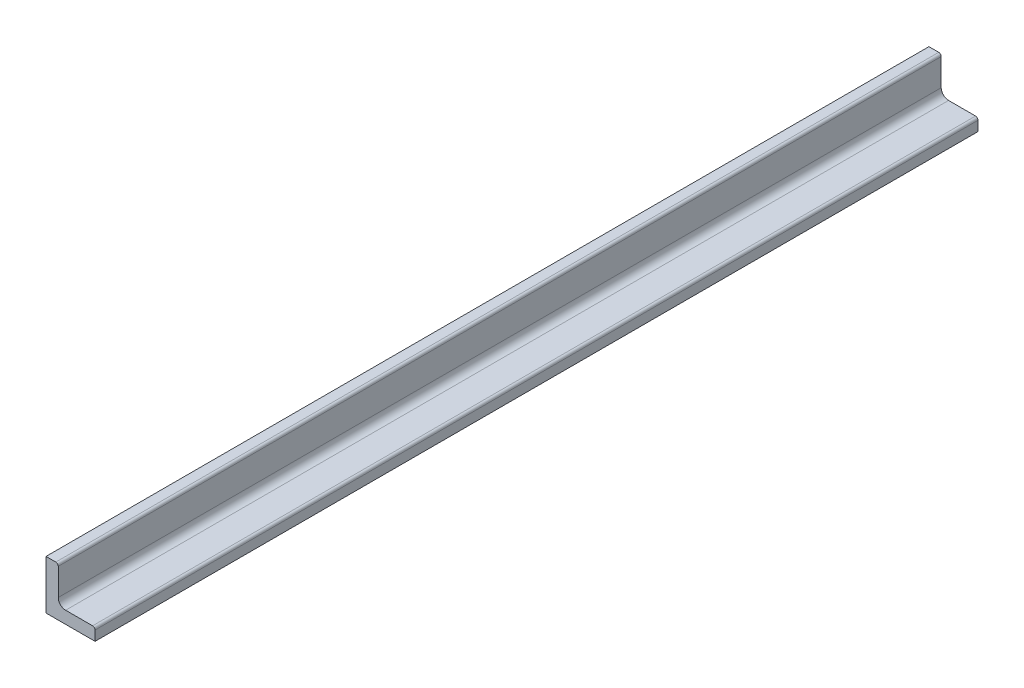
ISO-10303-21;
HEADER;
FILE_DESCRIPTION(('STEP AP214'),'2;1');
FILE_NAME('part.step','',(''),(''),'','','');
FILE_SCHEMA(('AUTOMOTIVE_DESIGN { 1 0 10303 214 1 1 1 1 }'));
ENDSEC;
DATA;
#1=APPLICATION_CONTEXT('core data for automotive mechanical design processes');
#2=APPLICATION_PROTOCOL_DEFINITION('international standard','automotive_design',2000,#1);
#3=PRODUCT_CONTEXT('',#1,'mechanical');
#4=PRODUCT('Part','Part','',(#3));
#5=PRODUCT_RELATED_PRODUCT_CATEGORY('part','',(#4));
#6=PRODUCT_DEFINITION_FORMATION('','',#4);
#7=PRODUCT_DEFINITION_CONTEXT('part definition',#1,'design');
#8=PRODUCT_DEFINITION('design','',#6,#7);
#9=PRODUCT_DEFINITION_SHAPE('','',#8);
#10=(LENGTH_UNIT() NAMED_UNIT(*) SI_UNIT(.MILLI.,.METRE.));
#11=(NAMED_UNIT(*) PLANE_ANGLE_UNIT() SI_UNIT($,.RADIAN.));
#12=(NAMED_UNIT(*) SI_UNIT($,.STERADIAN.) SOLID_ANGLE_UNIT());
#13=UNCERTAINTY_MEASURE_WITH_UNIT(LENGTH_MEASURE(1.E-05),#10,'distance_accuracy_value','');
#14=(GEOMETRIC_REPRESENTATION_CONTEXT(3) GLOBAL_UNCERTAINTY_ASSIGNED_CONTEXT((#13)) GLOBAL_UNIT_ASSIGNED_CONTEXT((#10,
#11,#12)) REPRESENTATION_CONTEXT('',''));
#15=CARTESIAN_POINT('',(0.,0.,0.));
#16=DIRECTION('',(0.,0.,1.));
#17=DIRECTION('',(1.,0.,0.));
#18=AXIS2_PLACEMENT_3D('',#15,#16,#17);
#19=CARTESIAN_POINT('',(1.905,1.905,228.6));
#20=DIRECTION('',(0.,0.,-1.));
#21=DIRECTION('',(-1.,0.,0.));
#22=AXIS2_PLACEMENT_3D('',#19,#20,#21);
#23=CYLINDRICAL_SURFACE('',#22,1.905);
#24=CARTESIAN_POINT('',(1.905,1.905,0.));
#25=DIRECTION('',(0.,0.,-1.));
#26=DIRECTION('',(1.,0.,0.));
#27=AXIS2_PLACEMENT_3D('',#24,#25,#26);
#28=CIRCLE('',#27,1.905);
#29=CARTESIAN_POINT('',(1.905,0.,0.));
#30=VERTEX_POINT('',#29);
#31=CARTESIAN_POINT('',(0.,1.905,0.));
#32=VERTEX_POINT('',#31);
#33=EDGE_CURVE('E143',#30,#32,#28,.T.);
#34=ORIENTED_EDGE('',*,*,#33,.T.);
#35=DIRECTION('',(0.,0.,-1.));
#36=VECTOR('',#35,1.);
#37=CARTESIAN_POINT('',(0.,1.905,228.6));
#38=LINE('',#37,#36);
#39=CARTESIAN_POINT('',(0.,1.905,228.6));
#40=VERTEX_POINT('',#39);
#41=EDGE_CURVE('E11',#40,#32,#38,.T.);
#42=ORIENTED_EDGE('',*,*,#41,.F.);
#43=CARTESIAN_POINT('',(1.905,1.905,228.6));
#44=DIRECTION('',(0.,0.,-1.));
#45=DIRECTION('',(1.,0.,0.));
#46=AXIS2_PLACEMENT_3D('',#43,#44,#45);
#47=CIRCLE('',#46,1.905);
#48=CARTESIAN_POINT('',(1.905,0.,228.6));
#49=VERTEX_POINT('',#48);
#50=EDGE_CURVE('E161',#49,#40,#47,.T.);
#51=ORIENTED_EDGE('',*,*,#50,.F.);
#52=DIRECTION('',(0.,0.,-1.));
#53=VECTOR('',#52,1.);
#54=CARTESIAN_POINT('',(1.905,0.,228.6));
#55=LINE('',#54,#53);
#56=EDGE_CURVE('E139',#49,#30,#55,.T.);
#57=ORIENTED_EDGE('',*,*,#56,.T.);
#58=EDGE_LOOP('',(#34,#42,#51,#57));
#59=FACE_BOUND('',#58,.T.);
#60=ADVANCED_FACE('F35',(#59),#23,.F.);
#61=CARTESIAN_POINT('',(0.,1.905,228.6));
#62=DIRECTION('',(-1.,0.,0.));
#63=DIRECTION('',(0.,-1.,0.));
#64=AXIS2_PLACEMENT_3D('',#61,#62,#63);
#65=PLANE('',#64);
#66=DIRECTION('',(0.,1.,0.));
#67=VECTOR('',#66,1.);
#68=CARTESIAN_POINT('',(0.,1.905,0.));
#69=LINE('',#68,#67);
#70=CARTESIAN_POINT('',(0.,8.89000000000002,0.));
#71=VERTEX_POINT('',#70);
#72=EDGE_CURVE('E146',#32,#71,#69,.T.);
#73=ORIENTED_EDGE('',*,*,#72,.T.);
#74=DIRECTION('',(0.,0.,-1.));
#75=VECTOR('',#74,1.);
#76=CARTESIAN_POINT('',(0.,8.89000000000002,228.6));
#77=LINE('',#76,#75);
#78=CARTESIAN_POINT('',(0.,8.89000000000002,228.6));
#79=VERTEX_POINT('',#78);
#80=EDGE_CURVE('E43',#79,#71,#77,.T.);
#81=ORIENTED_EDGE('',*,*,#80,.F.);
#82=DIRECTION('',(0.,1.,0.));
#83=VECTOR('',#82,1.);
#84=CARTESIAN_POINT('',(0.,1.905,228.6));
#85=LINE('',#84,#83);
#86=EDGE_CURVE('E100',#40,#79,#85,.T.);
#87=ORIENTED_EDGE('',*,*,#86,.F.);
#88=ORIENTED_EDGE('',*,*,#41,.T.);
#89=EDGE_LOOP('',(#73,#81,#87,#88));
#90=FACE_BOUND('',#89,.T.);
#91=ADVANCED_FACE('F210',(#90),#65,.F.);
#92=CARTESIAN_POINT('',(-0.635,8.89000000000002,228.6));
#93=DIRECTION('',(0.,0.,-1.));
#94=DIRECTION('',(-1.,0.,0.));
#95=AXIS2_PLACEMENT_3D('',#92,#93,#94);
#96=CYLINDRICAL_SURFACE('',#95,0.634999999999998);
#97=CARTESIAN_POINT('',(-0.635,8.89000000000002,0.));
#98=DIRECTION('',(0.,0.,1.));
#99=DIRECTION('',(1.,0.,0.));
#100=AXIS2_PLACEMENT_3D('',#97,#98,#99);
#101=CIRCLE('',#100,0.634999999999998);
#102=CARTESIAN_POINT('',(-0.635,9.52500000000002,0.));
#103=VERTEX_POINT('',#102);
#104=EDGE_CURVE('E148',#71,#103,#101,.T.);
#105=ORIENTED_EDGE('',*,*,#104,.T.);
#106=DIRECTION('',(0.,0.,-1.));
#107=VECTOR('',#106,1.);
#108=CARTESIAN_POINT('',(-0.635,9.52500000000002,228.6));
#109=LINE('',#108,#107);
#110=CARTESIAN_POINT('',(-0.635,9.52500000000002,228.6));
#111=VERTEX_POINT('',#110);
#112=EDGE_CURVE('E174',#111,#103,#109,.T.);
#113=ORIENTED_EDGE('',*,*,#112,.F.);
#114=CARTESIAN_POINT('',(-0.635,8.89000000000002,228.6));
#115=DIRECTION('',(0.,0.,1.));
#116=DIRECTION('',(1.,0.,0.));
#117=AXIS2_PLACEMENT_3D('',#114,#115,#116);
#118=CIRCLE('',#117,0.634999999999998);
#119=EDGE_CURVE('E182',#79,#111,#118,.T.);
#120=ORIENTED_EDGE('',*,*,#119,.F.);
#121=ORIENTED_EDGE('',*,*,#80,.T.);
#122=EDGE_LOOP('',(#105,#113,#120,#121));
#123=FACE_BOUND('',#122,.T.);
#124=ADVANCED_FACE('F180',(#123),#96,.T.);
#125=CARTESIAN_POINT('',(-0.635,9.52500000000002,228.6));
#126=DIRECTION('',(0.,-1.,0.));
#127=DIRECTION('',(0.,0.,-1.));
#128=AXIS2_PLACEMENT_3D('',#125,#126,#127);
#129=PLANE('',#128);
#130=DIRECTION('',(-1.,0.,0.));
#131=VECTOR('',#130,1.);
#132=CARTESIAN_POINT('',(-0.635,9.52500000000002,0.));
#133=LINE('',#132,#131);
#134=CARTESIAN_POINT('',(-3.17499999999999,9.52500000000002,0.));
#135=VERTEX_POINT('',#134);
#136=EDGE_CURVE('E150',#103,#135,#133,.T.);
#137=ORIENTED_EDGE('',*,*,#136,.T.);
#138=DIRECTION('',(0.,0.,-1.));
#139=VECTOR('',#138,1.);
#140=CARTESIAN_POINT('',(-3.17499999999999,9.52500000000002,228.6));
#141=LINE('',#140,#139);
#142=CARTESIAN_POINT('',(-3.17499999999999,9.52500000000002,228.6));
#143=VERTEX_POINT('',#142);
#144=EDGE_CURVE('E171',#143,#135,#141,.T.);
#145=ORIENTED_EDGE('',*,*,#144,.F.);
#146=DIRECTION('',(-1.,0.,0.));
#147=VECTOR('',#146,1.);
#148=CARTESIAN_POINT('',(-0.635,9.52500000000002,228.6));
#149=LINE('',#148,#147);
#150=EDGE_CURVE('E200',#111,#143,#149,.T.);
#151=ORIENTED_EDGE('',*,*,#150,.F.);
#152=ORIENTED_EDGE('',*,*,#112,.T.);
#153=EDGE_LOOP('',(#137,#145,#151,#152));
#154=FACE_BOUND('',#153,.T.);
#155=ADVANCED_FACE('F191',(#154),#129,.F.);
#156=CARTESIAN_POINT('',(-3.17499999999999,9.52500000000002,228.6));
#157=DIRECTION('',(1.,0.,0.));
#158=DIRECTION('',(0.,1.,0.));
#159=AXIS2_PLACEMENT_3D('',#156,#157,#158);
#160=PLANE('',#159);
#161=DIRECTION('',(0.,-1.,0.));
#162=VECTOR('',#161,1.);
#163=CARTESIAN_POINT('',(-3.17499999999999,9.52500000000002,0.));
#164=LINE('',#163,#162);
#165=CARTESIAN_POINT('',(-3.17499999999999,-3.04799999999999,0.));
#166=VERTEX_POINT('',#165);
#167=EDGE_CURVE('E152',#135,#166,#164,.T.);
#168=ORIENTED_EDGE('',*,*,#167,.T.);
#169=DIRECTION('',(0.,0.,-1.));
#170=VECTOR('',#169,1.);
#171=CARTESIAN_POINT('',(-3.17499999999999,-3.04799999999999,228.6));
#172=LINE('',#171,#170);
#173=CARTESIAN_POINT('',(-3.17499999999999,-3.04799999999999,228.6));
#174=VERTEX_POINT('',#173);
#175=EDGE_CURVE('E168',#174,#166,#172,.T.);
#176=ORIENTED_EDGE('',*,*,#175,.F.);
#177=DIRECTION('',(0.,-1.,0.));
#178=VECTOR('',#177,1.);
#179=CARTESIAN_POINT('',(-3.17499999999999,9.52500000000002,228.6));
#180=LINE('',#179,#178);
#181=EDGE_CURVE('E197',#143,#174,#180,.T.);
#182=ORIENTED_EDGE('',*,*,#181,.F.);
#183=ORIENTED_EDGE('',*,*,#144,.T.);
#184=EDGE_LOOP('',(#168,#176,#182,#183));
#185=FACE_BOUND('',#184,.T.);
#186=ADVANCED_FACE('F195',(#185),#160,.F.);
#187=CARTESIAN_POINT('',(-3.04799999999999,-3.04799999999999,228.6));
#188=DIRECTION('',(0.,0.,-1.));
#189=DIRECTION('',(-1.,0.,0.));
#190=AXIS2_PLACEMENT_3D('',#187,#188,#189);
#191=CYLINDRICAL_SURFACE('',#190,0.127000000000001);
#192=CARTESIAN_POINT('',(-3.04799999999999,-3.04799999999999,0.));
#193=DIRECTION('',(0.,0.,1.));
#194=DIRECTION('',(1.,0.,0.));
#195=AXIS2_PLACEMENT_3D('',#192,#193,#194);
#196=CIRCLE('',#195,0.127000000000001);
#197=CARTESIAN_POINT('',(-3.04799999999999,-3.17499999999999,0.));
#198=VERTEX_POINT('',#197);
#199=EDGE_CURVE('E154',#166,#198,#196,.T.);
#200=ORIENTED_EDGE('',*,*,#199,.T.);
#201=DIRECTION('',(0.,0.,-1.));
#202=VECTOR('',#201,1.);
#203=CARTESIAN_POINT('',(-3.04799999999999,-3.17499999999999,228.6));
#204=LINE('',#203,#202);
#205=CARTESIAN_POINT('',(-3.04799999999999,-3.17499999999999,228.6));
#206=VERTEX_POINT('',#205);
#207=EDGE_CURVE('E165',#206,#198,#204,.T.);
#208=ORIENTED_EDGE('',*,*,#207,.F.);
#209=CARTESIAN_POINT('',(-3.04799999999999,-3.04799999999999,228.6));
#210=DIRECTION('',(0.,0.,1.));
#211=DIRECTION('',(1.,0.,0.));
#212=AXIS2_PLACEMENT_3D('',#209,#210,#211);
#213=CIRCLE('',#212,0.127000000000001);
#214=EDGE_CURVE('E199',#174,#206,#213,.T.);
#215=ORIENTED_EDGE('',*,*,#214,.F.);
#216=ORIENTED_EDGE('',*,*,#175,.T.);
#217=EDGE_LOOP('',(#200,#208,#215,#216));
#218=FACE_BOUND('',#217,.T.);
#219=ADVANCED_FACE('F222',(#218),#191,.T.);
#220=CARTESIAN_POINT('',(-3.04799999999999,-3.17499999999999,228.6));
#221=DIRECTION('',(0.,1.,0.));
#222=DIRECTION('',(-1.,0.,0.));
#223=AXIS2_PLACEMENT_3D('',#220,#221,#222);
#224=PLANE('',#223);
#225=DIRECTION('',(1.,0.,0.));
#226=VECTOR('',#225,1.);
#227=CARTESIAN_POINT('',(-3.04799999999999,-3.17499999999999,0.));
#228=LINE('',#227,#226);
#229=CARTESIAN_POINT('',(9.52499999999999,-3.17499999999999,0.));
#230=VERTEX_POINT('',#229);
#231=EDGE_CURVE('E156',#198,#230,#228,.T.);
#232=ORIENTED_EDGE('',*,*,#231,.T.);
#233=DIRECTION('',(0.,0.,-1.));
#234=VECTOR('',#233,1.);
#235=CARTESIAN_POINT('',(9.52499999999999,-3.17499999999999,228.6));
#236=LINE('',#235,#234);
#237=CARTESIAN_POINT('',(9.52499999999999,-3.17499999999999,228.6));
#238=VERTEX_POINT('',#237);
#239=EDGE_CURVE('E134',#238,#230,#236,.T.);
#240=ORIENTED_EDGE('',*,*,#239,.F.);
#241=DIRECTION('',(1.,0.,0.));
#242=VECTOR('',#241,1.);
#243=CARTESIAN_POINT('',(-3.04799999999999,-3.17499999999999,228.6));
#244=LINE('',#243,#242);
#245=EDGE_CURVE('E125',#206,#238,#244,.T.);
#246=ORIENTED_EDGE('',*,*,#245,.F.);
#247=ORIENTED_EDGE('',*,*,#207,.T.);
#248=EDGE_LOOP('',(#232,#240,#246,#247));
#249=FACE_BOUND('',#248,.T.);
#250=ADVANCED_FACE('F225',(#249),#224,.F.);
#251=CARTESIAN_POINT('',(9.52499999999999,-3.17499999999999,228.6));
#252=DIRECTION('',(-1.,0.,0.));
#253=DIRECTION('',(0.,0.,1.));
#254=AXIS2_PLACEMENT_3D('',#251,#252,#253);
#255=PLANE('',#254);
#256=DIRECTION('',(0.,1.,0.));
#257=VECTOR('',#256,1.);
#258=CARTESIAN_POINT('',(9.52499999999999,-3.17499999999999,0.));
#259=LINE('',#258,#257);
#260=CARTESIAN_POINT('',(9.52499999999999,-0.635,0.));
#261=VERTEX_POINT('',#260);
#262=EDGE_CURVE('E133',#230,#261,#259,.T.);
#263=ORIENTED_EDGE('',*,*,#262,.T.);
#264=DIRECTION('',(0.,0.,-1.));
#265=VECTOR('',#264,1.);
#266=CARTESIAN_POINT('',(9.52499999999999,-0.635,228.6));
#267=LINE('',#266,#265);
#268=CARTESIAN_POINT('',(9.52499999999999,-0.635,228.6));
#269=VERTEX_POINT('',#268);
#270=EDGE_CURVE('E130',#269,#261,#267,.T.);
#271=ORIENTED_EDGE('',*,*,#270,.F.);
#272=DIRECTION('',(0.,1.,0.));
#273=VECTOR('',#272,1.);
#274=CARTESIAN_POINT('',(9.52499999999999,-3.17499999999999,228.6));
#275=LINE('',#274,#273);
#276=EDGE_CURVE('E119',#238,#269,#275,.T.);
#277=ORIENTED_EDGE('',*,*,#276,.F.);
#278=ORIENTED_EDGE('',*,*,#239,.T.);
#279=EDGE_LOOP('',(#263,#271,#277,#278));
#280=FACE_BOUND('',#279,.T.);
#281=ADVANCED_FACE('F131',(#280),#255,.F.);
#282=CARTESIAN_POINT('',(8.89,-0.635,228.6));
#283=DIRECTION('',(0.,0.,-1.));
#284=DIRECTION('',(-1.,0.,0.));
#285=AXIS2_PLACEMENT_3D('',#282,#283,#284);
#286=CYLINDRICAL_SURFACE('',#285,0.634999999999998);
#287=CARTESIAN_POINT('',(8.89,-0.635,0.));
#288=DIRECTION('',(0.,0.,1.));
#289=DIRECTION('',(1.,0.,0.));
#290=AXIS2_PLACEMENT_3D('',#287,#288,#289);
#291=CIRCLE('',#290,0.634999999999998);
#292=CARTESIAN_POINT('',(8.89,0.,0.));
#293=VERTEX_POINT('',#292);
#294=EDGE_CURVE('E86',#261,#293,#291,.T.);
#295=ORIENTED_EDGE('',*,*,#294,.T.);
#296=DIRECTION('',(0.,0.,-1.));
#297=VECTOR('',#296,1.);
#298=CARTESIAN_POINT('',(8.89,0.,228.6));
#299=LINE('',#298,#297);
#300=CARTESIAN_POINT('',(8.89,0.,228.6));
#301=VERTEX_POINT('',#300);
#302=EDGE_CURVE('E135',#301,#293,#299,.T.);
#303=ORIENTED_EDGE('',*,*,#302,.F.);
#304=CARTESIAN_POINT('',(8.89,-0.635,228.6));
#305=DIRECTION('',(0.,0.,1.));
#306=DIRECTION('',(1.,0.,0.));
#307=AXIS2_PLACEMENT_3D('',#304,#305,#306);
#308=CIRCLE('',#307,0.634999999999998);
#309=EDGE_CURVE('E123',#269,#301,#308,.T.);
#310=ORIENTED_EDGE('',*,*,#309,.F.);
#311=ORIENTED_EDGE('',*,*,#270,.T.);
#312=EDGE_LOOP('',(#295,#303,#310,#311));
#313=FACE_BOUND('',#312,.T.);
#314=ADVANCED_FACE('F137',(#313),#286,.T.);
#315=CARTESIAN_POINT('',(8.89,0.,228.6));
#316=DIRECTION('',(0.,-1.,0.));
#317=DIRECTION('',(1.,0.,0.));
#318=AXIS2_PLACEMENT_3D('',#315,#316,#317);
#319=PLANE('',#318);
#320=DIRECTION('',(-1.,0.,0.));
#321=VECTOR('',#320,1.);
#322=CARTESIAN_POINT('',(8.89,0.,0.));
#323=LINE('',#322,#321);
#324=EDGE_CURVE('E92',#293,#30,#323,.T.);
#325=ORIENTED_EDGE('',*,*,#324,.T.);
#326=ORIENTED_EDGE('',*,*,#56,.F.);
#327=DIRECTION('',(-1.,0.,0.));
#328=VECTOR('',#327,1.);
#329=CARTESIAN_POINT('',(8.89,0.,228.6));
#330=LINE('',#329,#328);
#331=EDGE_CURVE('E51',#301,#49,#330,.T.);
#332=ORIENTED_EDGE('',*,*,#331,.F.);
#333=ORIENTED_EDGE('',*,*,#302,.T.);
#334=EDGE_LOOP('',(#325,#326,#332,#333));
#335=FACE_BOUND('',#334,.T.);
#336=ADVANCED_FACE('F234',(#335),#319,.F.);
#337=CARTESIAN_POINT('',(1.905,1.905,228.6));
#338=DIRECTION('',(0.,0.,1.));
#339=DIRECTION('',(1.,0.,0.));
#340=AXIS2_PLACEMENT_3D('',#337,#338,#339);
#341=PLANE('',#340);
#342=ORIENTED_EDGE('',*,*,#50,.T.);
#343=ORIENTED_EDGE('',*,*,#86,.T.);
#344=ORIENTED_EDGE('',*,*,#119,.T.);
#345=ORIENTED_EDGE('',*,*,#150,.T.);
#346=ORIENTED_EDGE('',*,*,#181,.T.);
#347=ORIENTED_EDGE('',*,*,#214,.T.);
#348=ORIENTED_EDGE('',*,*,#245,.T.);
#349=ORIENTED_EDGE('',*,*,#276,.T.);
#350=ORIENTED_EDGE('',*,*,#309,.T.);
#351=ORIENTED_EDGE('',*,*,#331,.T.);
#352=EDGE_LOOP('',(#342,#343,#344,#345,#346,#347,#348,#349,#350,#351));
#353=FACE_BOUND('',#352,.T.);
#354=ADVANCED_FACE('F121',(#353),#341,.T.);
#355=CARTESIAN_POINT('',(1.905,1.905,0.));
#356=DIRECTION('',(0.,0.,1.));
#357=DIRECTION('',(1.,0.,0.));
#358=AXIS2_PLACEMENT_3D('',#355,#356,#357);
#359=PLANE('',#358);
#360=ORIENTED_EDGE('',*,*,#33,.F.);
#361=ORIENTED_EDGE('',*,*,#324,.F.);
#362=ORIENTED_EDGE('',*,*,#294,.F.);
#363=ORIENTED_EDGE('',*,*,#262,.F.);
#364=ORIENTED_EDGE('',*,*,#231,.F.);
#365=ORIENTED_EDGE('',*,*,#199,.F.);
#366=ORIENTED_EDGE('',*,*,#167,.F.);
#367=ORIENTED_EDGE('',*,*,#136,.F.);
#368=ORIENTED_EDGE('',*,*,#104,.F.);
#369=ORIENTED_EDGE('',*,*,#72,.F.);
#370=EDGE_LOOP('',(#360,#361,#362,#363,#364,#365,#366,#367,#368,#369));
#371=FACE_BOUND('',#370,.T.);
#372=ADVANCED_FACE('F186',(#371),#359,.F.);
#373=CLOSED_SHELL('',(#60,#91,#124,#155,#186,#219,#250,#281,#314,#336,#354,#372));
#374=MANIFOLD_SOLID_BREP('B2',#373);
#375=ADVANCED_BREP_SHAPE_REPRESENTATION('',(#18,#374),#14);
#376=SHAPE_DEFINITION_REPRESENTATION(#9,#375);
ENDSEC;
END-ISO-10303-21;
